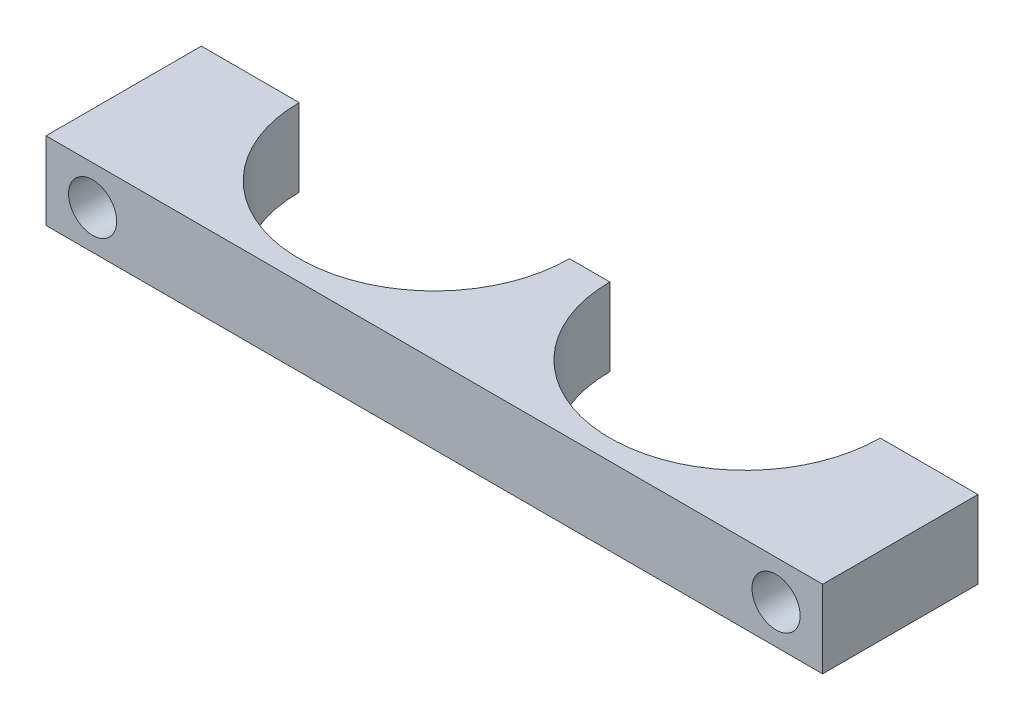
ISO-10303-21;
HEADER;
FILE_DESCRIPTION(('STEP AP214'),'2;1');
FILE_NAME('part.step','',(''),(''),'','','');
FILE_SCHEMA(('AUTOMOTIVE_DESIGN { 1 0 10303 214 1 1 1 1 }'));
ENDSEC;
DATA;
#1=APPLICATION_CONTEXT('core data for automotive mechanical design processes');
#2=APPLICATION_PROTOCOL_DEFINITION('international standard','automotive_design',2000,#1);
#3=PRODUCT_CONTEXT('',#1,'mechanical');
#4=PRODUCT('Part','Part','',(#3));
#5=PRODUCT_RELATED_PRODUCT_CATEGORY('part','',(#4));
#6=PRODUCT_DEFINITION_FORMATION('','',#4);
#7=PRODUCT_DEFINITION_CONTEXT('part definition',#1,'design');
#8=PRODUCT_DEFINITION('design','',#6,#7);
#9=PRODUCT_DEFINITION_SHAPE('','',#8);
#10=(LENGTH_UNIT() NAMED_UNIT(*) SI_UNIT(.MILLI.,.METRE.));
#11=(NAMED_UNIT(*) PLANE_ANGLE_UNIT() SI_UNIT($,.RADIAN.));
#12=(NAMED_UNIT(*) SI_UNIT($,.STERADIAN.) SOLID_ANGLE_UNIT());
#13=UNCERTAINTY_MEASURE_WITH_UNIT(LENGTH_MEASURE(1.E-05),#10,'distance_accuracy_value','');
#14=(GEOMETRIC_REPRESENTATION_CONTEXT(3) GLOBAL_UNCERTAINTY_ASSIGNED_CONTEXT((#13)) GLOBAL_UNIT_ASSIGNED_CONTEXT((#10,
#11,#12)) REPRESENTATION_CONTEXT('',''));
#15=CARTESIAN_POINT('',(0.,0.,0.));
#16=DIRECTION('',(0.,0.,1.));
#17=DIRECTION('',(1.,0.,0.));
#18=AXIS2_PLACEMENT_3D('',#15,#16,#17);
#19=CARTESIAN_POINT('',(-34.6072186836518,10.,1.76220806794054));
#20=DIRECTION('',(1.,0.,0.));
#21=DIRECTION('',(0.,0.,-1.));
#22=AXIS2_PLACEMENT_3D('',#19,#20,#21);
#23=PLANE('',#22);
#24=DIRECTION('',(0.,0.,1.));
#25=VECTOR('',#24,1.);
#26=CARTESIAN_POINT('',(-34.6072186836518,0.,1.76220806794054));
#27=LINE('',#26,#25);
#28=CARTESIAN_POINT('',(-34.6072186836518,0.,1.76220806794054));
#29=VERTEX_POINT('',#28);
#30=CARTESIAN_POINT('',(-34.6072186836518,0.,21.7622080679405));
#31=VERTEX_POINT('',#30);
#32=EDGE_CURVE('E128',#29,#31,#27,.T.);
#33=ORIENTED_EDGE('',*,*,#32,.T.);
#34=DIRECTION('',(0.,-1.,0.));
#35=VECTOR('',#34,1.);
#36=CARTESIAN_POINT('',(-34.6072186836518,10.,21.7622080679405));
#37=LINE('',#36,#35);
#38=CARTESIAN_POINT('',(-34.6072186836518,10.,21.7622080679405));
#39=VERTEX_POINT('',#38);
#40=EDGE_CURVE('E11',#39,#31,#37,.T.);
#41=ORIENTED_EDGE('',*,*,#40,.F.);
#42=DIRECTION('',(0.,0.,1.));
#43=VECTOR('',#42,1.);
#44=CARTESIAN_POINT('',(-34.6072186836518,10.,1.76220806794054));
#45=LINE('',#44,#43);
#46=CARTESIAN_POINT('',(-34.6072186836518,10.,1.76220806794054));
#47=VERTEX_POINT('',#46);
#48=EDGE_CURVE('E143',#47,#39,#45,.T.);
#49=ORIENTED_EDGE('',*,*,#48,.F.);
#50=DIRECTION('',(0.,-1.,0.));
#51=VECTOR('',#50,1.);
#52=CARTESIAN_POINT('',(-34.6072186836518,10.,1.76220806794054));
#53=LINE('',#52,#51);
#54=EDGE_CURVE('E124',#47,#29,#53,.T.);
#55=ORIENTED_EDGE('',*,*,#54,.T.);
#56=EDGE_LOOP('',(#33,#41,#49,#55));
#57=FACE_BOUND('',#56,.T.);
#58=ADVANCED_FACE('F32',(#57),#23,.F.);
#59=CARTESIAN_POINT('',(-34.6072186836518,10.,21.7622080679405));
#60=DIRECTION('',(0.,0.,-1.));
#61=DIRECTION('',(-1.,0.,0.));
#62=AXIS2_PLACEMENT_3D('',#59,#60,#61);
#63=PLANE('',#62);
#64=CARTESIAN_POINT('',(-28.6072186836518,5.,21.7622080679405));
#65=DIRECTION('',(0.,0.,1.));
#66=DIRECTION('',(1.,0.,0.));
#67=AXIS2_PLACEMENT_3D('',#64,#65,#66);
#68=CIRCLE('',#67,3.1);
#69=CARTESIAN_POINT('',(-25.5072186836518,5.,21.7622080679405));
#70=VERTEX_POINT('',#69);
#71=EDGE_CURVE('E182',#70,#70,#68,.T.);
#72=ORIENTED_EDGE('',*,*,#71,.F.);
#73=EDGE_LOOP('',(#72));
#74=FACE_BOUND('',#73,.T.);
#75=CARTESIAN_POINT('',(59.3927813163482,5.,21.7622080679405));
#76=DIRECTION('',(0.,0.,1.));
#77=DIRECTION('',(1.,0.,0.));
#78=AXIS2_PLACEMENT_3D('',#75,#76,#77);
#79=CIRCLE('',#78,3.1);
#80=CARTESIAN_POINT('',(62.4927813163482,5.,21.7622080679405));
#81=VERTEX_POINT('',#80);
#82=EDGE_CURVE('E176',#81,#81,#79,.T.);
#83=ORIENTED_EDGE('',*,*,#82,.F.);
#84=EDGE_LOOP('',(#83));
#85=FACE_BOUND('',#84,.T.);
#86=DIRECTION('',(1.,0.,0.));
#87=VECTOR('',#86,1.);
#88=CARTESIAN_POINT('',(-34.6072186836518,0.,21.7622080679405));
#89=LINE('',#88,#87);
#90=CARTESIAN_POINT('',(65.3927813163482,0.,21.7622080679405));
#91=VERTEX_POINT('',#90);
#92=EDGE_CURVE('E131',#31,#91,#89,.T.);
#93=ORIENTED_EDGE('',*,*,#92,.T.);
#94=DIRECTION('',(0.,-1.,0.));
#95=VECTOR('',#94,1.);
#96=CARTESIAN_POINT('',(65.3927813163482,10.,21.7622080679405));
#97=LINE('',#96,#95);
#98=CARTESIAN_POINT('',(65.3927813163482,10.,21.7622080679405));
#99=VERTEX_POINT('',#98);
#100=EDGE_CURVE('E40',#99,#91,#97,.T.);
#101=ORIENTED_EDGE('',*,*,#100,.F.);
#102=DIRECTION('',(1.,0.,0.));
#103=VECTOR('',#102,1.);
#104=CARTESIAN_POINT('',(-34.6072186836518,10.,21.7622080679405));
#105=LINE('',#104,#103);
#106=EDGE_CURVE('E91',#39,#99,#105,.T.);
#107=ORIENTED_EDGE('',*,*,#106,.F.);
#108=ORIENTED_EDGE('',*,*,#40,.T.);
#109=EDGE_LOOP('',(#93,#101,#107,#108));
#110=FACE_BOUND('',#109,.T.);
#111=ADVANCED_FACE('F197',(#74,#85,#110),#63,.F.);
#112=CARTESIAN_POINT('',(65.3927813163482,10.,1.76220806794054));
#113=DIRECTION('',(-1.,0.,0.));
#114=DIRECTION('',(0.,0.,1.));
#115=AXIS2_PLACEMENT_3D('',#112,#113,#114);
#116=PLANE('',#115);
#117=DIRECTION('',(0.,0.,-1.));
#118=VECTOR('',#117,1.);
#119=CARTESIAN_POINT('',(65.3927813163482,0.,1.76220806794054));
#120=LINE('',#119,#118);
#121=CARTESIAN_POINT('',(65.3927813163482,0.,1.76220806794054));
#122=VERTEX_POINT('',#121);
#123=EDGE_CURVE('E134',#91,#122,#120,.T.);
#124=ORIENTED_EDGE('',*,*,#123,.T.);
#125=DIRECTION('',(0.,-1.,0.));
#126=VECTOR('',#125,1.);
#127=CARTESIAN_POINT('',(65.3927813163482,10.,1.76220806794054));
#128=LINE('',#127,#126);
#129=CARTESIAN_POINT('',(65.3927813163482,10.,1.76220806794054));
#130=VERTEX_POINT('',#129);
#131=EDGE_CURVE('E150',#130,#122,#128,.T.);
#132=ORIENTED_EDGE('',*,*,#131,.F.);
#133=DIRECTION('',(0.,0.,-1.));
#134=VECTOR('',#133,1.);
#135=CARTESIAN_POINT('',(65.3927813163482,10.,1.76220806794054));
#136=LINE('',#135,#134);
#137=EDGE_CURVE('E158',#99,#130,#136,.T.);
#138=ORIENTED_EDGE('',*,*,#137,.F.);
#139=ORIENTED_EDGE('',*,*,#100,.T.);
#140=EDGE_LOOP('',(#124,#132,#138,#139));
#141=FACE_BOUND('',#140,.T.);
#142=ADVANCED_FACE('F156',(#141),#116,.F.);
#143=CARTESIAN_POINT('',(52.7927813163482,10.,1.76220806794054));
#144=DIRECTION('',(0.,0.,1.));
#145=DIRECTION('',(1.,0.,0.));
#146=AXIS2_PLACEMENT_3D('',#143,#144,#145);
#147=PLANE('',#146);
#148=CARTESIAN_POINT('',(59.3927813163482,5.,1.76220806794054));
#149=DIRECTION('',(0.,0.,1.));
#150=DIRECTION('',(1.,0.,0.));
#151=AXIS2_PLACEMENT_3D('',#148,#149,#150);
#152=CIRCLE('',#151,3.1);
#153=CARTESIAN_POINT('',(62.4927813163482,5.,1.76220806794054));
#154=VERTEX_POINT('',#153);
#155=EDGE_CURVE('E179',#154,#154,#152,.T.);
#156=ORIENTED_EDGE('',*,*,#155,.T.);
#157=EDGE_LOOP('',(#156));
#158=FACE_BOUND('',#157,.T.);
#159=DIRECTION('',(-1.,0.,0.));
#160=VECTOR('',#159,1.);
#161=CARTESIAN_POINT('',(52.7927813163482,0.,1.76220806794054));
#162=LINE('',#161,#160);
#163=CARTESIAN_POINT('',(52.7927813163482,0.,1.76220806794054));
#164=VERTEX_POINT('',#163);
#165=EDGE_CURVE('E136',#122,#164,#162,.T.);
#166=ORIENTED_EDGE('',*,*,#165,.T.);
#167=DIRECTION('',(0.,-1.,0.));
#168=VECTOR('',#167,1.);
#169=CARTESIAN_POINT('',(52.7927813163482,10.,1.76220806794054));
#170=LINE('',#169,#168);
#171=CARTESIAN_POINT('',(52.7927813163482,10.,1.76220806794054));
#172=VERTEX_POINT('',#171);
#173=EDGE_CURVE('E147',#172,#164,#170,.T.);
#174=ORIENTED_EDGE('',*,*,#173,.F.);
#175=DIRECTION('',(-1.,0.,0.));
#176=VECTOR('',#175,1.);
#177=CARTESIAN_POINT('',(52.7927813163482,10.,1.76220806794054));
#178=LINE('',#177,#176);
#179=EDGE_CURVE('E170',#130,#172,#178,.T.);
#180=ORIENTED_EDGE('',*,*,#179,.F.);
#181=ORIENTED_EDGE('',*,*,#131,.T.);
#182=EDGE_LOOP('',(#166,#174,#180,#181));
#183=FACE_BOUND('',#182,.T.);
#184=ADVANCED_FACE('F166',(#158,#183),#147,.F.);
#185=CARTESIAN_POINT('',(35.3927813163482,10.,1.76220806794054));
#186=DIRECTION('',(0.,-1.,0.));
#187=DIRECTION('',(0.,0.,-1.));
#188=AXIS2_PLACEMENT_3D('',#185,#186,#187);
#189=CYLINDRICAL_SURFACE('',#188,17.4);
#190=CARTESIAN_POINT('',(35.3927813163482,0.,1.76220806794054));
#191=DIRECTION('',(0.,-1.,0.));
#192=DIRECTION('',(0.,0.,1.));
#193=AXIS2_PLACEMENT_3D('',#190,#191,#192);
#194=CIRCLE('',#193,17.4);
#195=CARTESIAN_POINT('',(17.9927813163482,0.,1.76220806794054));
#196=VERTEX_POINT('',#195);
#197=EDGE_CURVE('E138',#164,#196,#194,.T.);
#198=ORIENTED_EDGE('',*,*,#197,.T.);
#199=DIRECTION('',(0.,-1.,0.));
#200=VECTOR('',#199,1.);
#201=CARTESIAN_POINT('',(17.9927813163482,10.,1.76220806794054));
#202=LINE('',#201,#200);
#203=CARTESIAN_POINT('',(17.9927813163482,10.,1.76220806794054));
#204=VERTEX_POINT('',#203);
#205=EDGE_CURVE('E119',#204,#196,#202,.T.);
#206=ORIENTED_EDGE('',*,*,#205,.F.);
#207=CARTESIAN_POINT('',(35.3927813163482,10.,1.76220806794054));
#208=DIRECTION('',(0.,-1.,0.));
#209=DIRECTION('',(0.,0.,1.));
#210=AXIS2_PLACEMENT_3D('',#207,#208,#209);
#211=CIRCLE('',#210,17.4);
#212=EDGE_CURVE('E110',#172,#204,#211,.T.);
#213=ORIENTED_EDGE('',*,*,#212,.F.);
#214=ORIENTED_EDGE('',*,*,#173,.T.);
#215=EDGE_LOOP('',(#198,#206,#213,#214));
#216=FACE_BOUND('',#215,.T.);
#217=ADVANCED_FACE('F169',(#216),#189,.F.);
#218=CARTESIAN_POINT('',(12.7927813163482,10.,1.76220806794054));
#219=DIRECTION('',(0.,0.,1.));
#220=DIRECTION('',(1.,0.,0.));
#221=AXIS2_PLACEMENT_3D('',#218,#219,#220);
#222=PLANE('',#221);
#223=DIRECTION('',(-1.,0.,0.));
#224=VECTOR('',#223,1.);
#225=CARTESIAN_POINT('',(12.7927813163482,0.,1.76220806794054));
#226=LINE('',#225,#224);
#227=CARTESIAN_POINT('',(12.7927813163482,0.,1.76220806794054));
#228=VERTEX_POINT('',#227);
#229=EDGE_CURVE('E118',#196,#228,#226,.T.);
#230=ORIENTED_EDGE('',*,*,#229,.T.);
#231=DIRECTION('',(0.,-1.,0.));
#232=VECTOR('',#231,1.);
#233=CARTESIAN_POINT('',(12.7927813163482,10.,1.76220806794054));
#234=LINE('',#233,#232);
#235=CARTESIAN_POINT('',(12.7927813163482,10.,1.76220806794054));
#236=VERTEX_POINT('',#235);
#237=EDGE_CURVE('E115',#236,#228,#234,.T.);
#238=ORIENTED_EDGE('',*,*,#237,.F.);
#239=DIRECTION('',(-1.,0.,0.));
#240=VECTOR('',#239,1.);
#241=CARTESIAN_POINT('',(12.7927813163482,10.,1.76220806794054));
#242=LINE('',#241,#240);
#243=EDGE_CURVE('E104',#204,#236,#242,.T.);
#244=ORIENTED_EDGE('',*,*,#243,.F.);
#245=ORIENTED_EDGE('',*,*,#205,.T.);
#246=EDGE_LOOP('',(#230,#238,#244,#245));
#247=FACE_BOUND('',#246,.T.);
#248=ADVANCED_FACE('F116',(#247),#222,.F.);
#249=CARTESIAN_POINT('',(-4.6072186836518,10.,1.76220806794054));
#250=DIRECTION('',(0.,-1.,0.));
#251=DIRECTION('',(0.,0.,-1.));
#252=AXIS2_PLACEMENT_3D('',#249,#250,#251);
#253=CYLINDRICAL_SURFACE('',#252,17.4);
#254=CARTESIAN_POINT('',(-4.6072186836518,0.,1.76220806794054));
#255=DIRECTION('',(0.,-1.,0.));
#256=DIRECTION('',(0.,0.,1.));
#257=AXIS2_PLACEMENT_3D('',#254,#255,#256);
#258=CIRCLE('',#257,17.4);
#259=CARTESIAN_POINT('',(-22.0072186836518,0.,1.76220806794054));
#260=VERTEX_POINT('',#259);
#261=EDGE_CURVE('E77',#228,#260,#258,.T.);
#262=ORIENTED_EDGE('',*,*,#261,.T.);
#263=DIRECTION('',(0.,-1.,0.));
#264=VECTOR('',#263,1.);
#265=CARTESIAN_POINT('',(-22.0072186836518,10.,1.76220806794054));
#266=LINE('',#265,#264);
#267=CARTESIAN_POINT('',(-22.0072186836518,10.,1.76220806794054));
#268=VERTEX_POINT('',#267);
#269=EDGE_CURVE('E120',#268,#260,#266,.T.);
#270=ORIENTED_EDGE('',*,*,#269,.F.);
#271=CARTESIAN_POINT('',(-4.6072186836518,10.,1.76220806794054));
#272=DIRECTION('',(0.,-1.,0.));
#273=DIRECTION('',(0.,0.,1.));
#274=AXIS2_PLACEMENT_3D('',#271,#272,#273);
#275=CIRCLE('',#274,17.4);
#276=EDGE_CURVE('E108',#236,#268,#275,.T.);
#277=ORIENTED_EDGE('',*,*,#276,.F.);
#278=ORIENTED_EDGE('',*,*,#237,.T.);
#279=EDGE_LOOP('',(#262,#270,#277,#278));
#280=FACE_BOUND('',#279,.T.);
#281=ADVANCED_FACE('F122',(#280),#253,.F.);
#282=CARTESIAN_POINT('',(-34.6072186836518,10.,1.76220806794054));
#283=DIRECTION('',(0.,0.,1.));
#284=DIRECTION('',(1.,0.,0.));
#285=AXIS2_PLACEMENT_3D('',#282,#283,#284);
#286=PLANE('',#285);
#287=CARTESIAN_POINT('',(-28.6072186836518,5.,1.76220806794054));
#288=DIRECTION('',(0.,0.,1.));
#289=DIRECTION('',(1.,0.,0.));
#290=AXIS2_PLACEMENT_3D('',#287,#288,#289);
#291=CIRCLE('',#290,3.1);
#292=CARTESIAN_POINT('',(-25.5072186836518,5.,1.76220806794054));
#293=VERTEX_POINT('',#292);
#294=EDGE_CURVE('E132',#293,#293,#291,.T.);
#295=ORIENTED_EDGE('',*,*,#294,.T.);
#296=EDGE_LOOP('',(#295));
#297=FACE_BOUND('',#296,.T.);
#298=DIRECTION('',(-1.,0.,0.));
#299=VECTOR('',#298,1.);
#300=CARTESIAN_POINT('',(-34.6072186836518,0.,1.76220806794054));
#301=LINE('',#300,#299);
#302=EDGE_CURVE('E83',#260,#29,#301,.T.);
#303=ORIENTED_EDGE('',*,*,#302,.T.);
#304=ORIENTED_EDGE('',*,*,#54,.F.);
#305=DIRECTION('',(-1.,0.,0.));
#306=VECTOR('',#305,1.);
#307=CARTESIAN_POINT('',(-34.6072186836518,10.,1.76220806794054));
#308=LINE('',#307,#306);
#309=EDGE_CURVE('E48',#268,#47,#308,.T.);
#310=ORIENTED_EDGE('',*,*,#309,.F.);
#311=ORIENTED_EDGE('',*,*,#269,.T.);
#312=EDGE_LOOP('',(#303,#304,#310,#311));
#313=FACE_BOUND('',#312,.T.);
#314=ADVANCED_FACE('F188',(#297,#313),#286,.F.);
#315=CARTESIAN_POINT('',(35.3927813163482,10.,1.76220806794054));
#316=DIRECTION('',(0.,1.,0.));
#317=DIRECTION('',(0.,0.,1.));
#318=AXIS2_PLACEMENT_3D('',#315,#316,#317);
#319=PLANE('',#318);
#320=ORIENTED_EDGE('',*,*,#48,.T.);
#321=ORIENTED_EDGE('',*,*,#106,.T.);
#322=ORIENTED_EDGE('',*,*,#137,.T.);
#323=ORIENTED_EDGE('',*,*,#179,.T.);
#324=ORIENTED_EDGE('',*,*,#212,.T.);
#325=ORIENTED_EDGE('',*,*,#243,.T.);
#326=ORIENTED_EDGE('',*,*,#276,.T.);
#327=ORIENTED_EDGE('',*,*,#309,.T.);
#328=EDGE_LOOP('',(#320,#321,#322,#323,#324,#325,#326,#327));
#329=FACE_BOUND('',#328,.T.);
#330=ADVANCED_FACE('F106',(#329),#319,.T.);
#331=CARTESIAN_POINT('',(35.3927813163482,0.,1.76220806794054));
#332=DIRECTION('',(0.,1.,0.));
#333=DIRECTION('',(0.,0.,1.));
#334=AXIS2_PLACEMENT_3D('',#331,#332,#333);
#335=PLANE('',#334);
#336=ORIENTED_EDGE('',*,*,#32,.F.);
#337=ORIENTED_EDGE('',*,*,#302,.F.);
#338=ORIENTED_EDGE('',*,*,#261,.F.);
#339=ORIENTED_EDGE('',*,*,#229,.F.);
#340=ORIENTED_EDGE('',*,*,#197,.F.);
#341=ORIENTED_EDGE('',*,*,#165,.F.);
#342=ORIENTED_EDGE('',*,*,#123,.F.);
#343=ORIENTED_EDGE('',*,*,#92,.F.);
#344=EDGE_LOOP('',(#336,#337,#338,#339,#340,#341,#342,#343));
#345=FACE_BOUND('',#344,.T.);
#346=ADVANCED_FACE('F162',(#345),#335,.F.);
#347=CARTESIAN_POINT('',(-28.6072186836518,5.,1.76220806794054));
#348=DIRECTION('',(0.,0.,1.));
#349=DIRECTION('',(1.,0.,0.));
#350=AXIS2_PLACEMENT_3D('',#347,#348,#349);
#351=CYLINDRICAL_SURFACE('',#350,3.1);
#352=ORIENTED_EDGE('',*,*,#294,.F.);
#353=EDGE_LOOP('',(#352));
#354=FACE_BOUND('',#353,.T.);
#355=ORIENTED_EDGE('',*,*,#71,.T.);
#356=EDGE_LOOP('',(#355));
#357=FACE_BOUND('',#356,.T.);
#358=ADVANCED_FACE('F190',(#354,#357),#351,.F.);
#359=CARTESIAN_POINT('',(59.3927813163482,5.,1.76220806794054));
#360=DIRECTION('',(0.,0.,1.));
#361=DIRECTION('',(1.,0.,0.));
#362=AXIS2_PLACEMENT_3D('',#359,#360,#361);
#363=CYLINDRICAL_SURFACE('',#362,3.1);
#364=ORIENTED_EDGE('',*,*,#155,.F.);
#365=EDGE_LOOP('',(#364));
#366=FACE_BOUND('',#365,.T.);
#367=ORIENTED_EDGE('',*,*,#82,.T.);
#368=EDGE_LOOP('',(#367));
#369=FACE_BOUND('',#368,.T.);
#370=ADVANCED_FACE('F193',(#366,#369),#363,.F.);
#371=CLOSED_SHELL('',(#58,#111,#142,#184,#217,#248,#281,#314,#330,#346,#358,#370));
#372=MANIFOLD_SOLID_BREP('B2',#371);
#373=ADVANCED_BREP_SHAPE_REPRESENTATION('',(#18,#372),#14);
#374=SHAPE_DEFINITION_REPRESENTATION(#9,#373);
ENDSEC;
END-ISO-10303-21;
